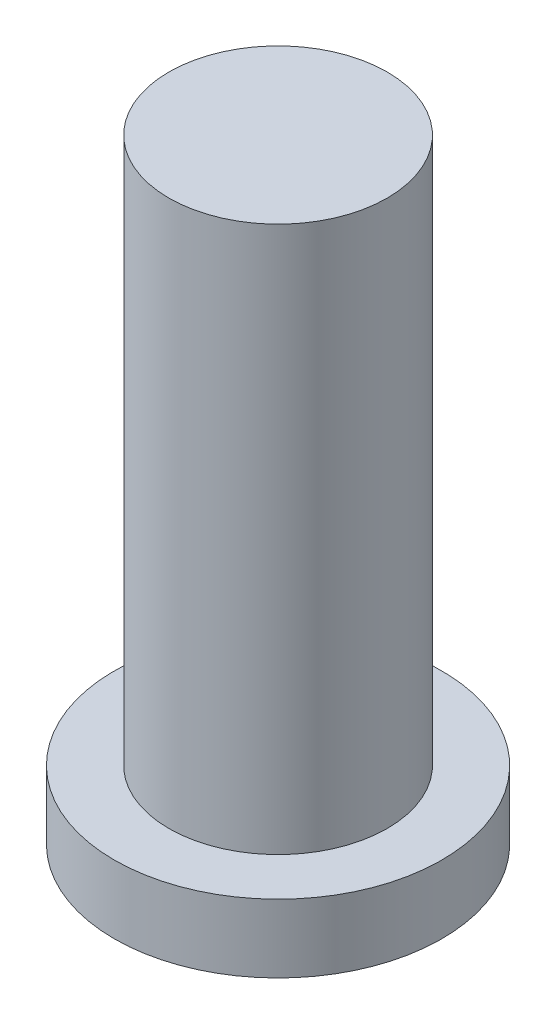
ISO-10303-21;
HEADER;
FILE_DESCRIPTION(('STEP AP214'),'2;1');
FILE_NAME('part.step','',(''),(''),'','','');
FILE_SCHEMA(('AUTOMOTIVE_DESIGN { 1 0 10303 214 1 1 1 1 }'));
ENDSEC;
DATA;
#1=APPLICATION_CONTEXT('core data for automotive mechanical design processes');
#2=APPLICATION_PROTOCOL_DEFINITION('international standard','automotive_design',2000,#1);
#3=PRODUCT_CONTEXT('',#1,'mechanical');
#4=PRODUCT('Part','Part','',(#3));
#5=PRODUCT_RELATED_PRODUCT_CATEGORY('part','',(#4));
#6=PRODUCT_DEFINITION_FORMATION('','',#4);
#7=PRODUCT_DEFINITION_CONTEXT('part definition',#1,'design');
#8=PRODUCT_DEFINITION('design','',#6,#7);
#9=PRODUCT_DEFINITION_SHAPE('','',#8);
#10=(LENGTH_UNIT() NAMED_UNIT(*) SI_UNIT(.MILLI.,.METRE.));
#11=(NAMED_UNIT(*) PLANE_ANGLE_UNIT() SI_UNIT($,.RADIAN.));
#12=(NAMED_UNIT(*) SI_UNIT($,.STERADIAN.) SOLID_ANGLE_UNIT());
#13=UNCERTAINTY_MEASURE_WITH_UNIT(LENGTH_MEASURE(1.E-05),#10,'distance_accuracy_value','');
#14=(GEOMETRIC_REPRESENTATION_CONTEXT(3) GLOBAL_UNCERTAINTY_ASSIGNED_CONTEXT((#13)) GLOBAL_UNIT_ASSIGNED_CONTEXT((#10,
#11,#12)) REPRESENTATION_CONTEXT('',''));
#15=CARTESIAN_POINT('',(0.,0.,0.));
#16=DIRECTION('',(0.,0.,1.));
#17=DIRECTION('',(1.,0.,0.));
#18=AXIS2_PLACEMENT_3D('',#15,#16,#17);
#19=CARTESIAN_POINT('',(0.,0.,0.));
#20=DIRECTION('',(0.,1.,0.));
#21=DIRECTION('',(0.,0.,1.));
#22=AXIS2_PLACEMENT_3D('',#19,#20,#21);
#23=PLANE('',#22);
#24=CARTESIAN_POINT('',(0.,0.,0.));
#25=DIRECTION('',(0.,1.,0.));
#26=DIRECTION('',(0.,0.,1.));
#27=AXIS2_PLACEMENT_3D('',#24,#25,#26);
#28=CIRCLE('',#27,2.4);
#29=CARTESIAN_POINT('',(0.,0.,2.4));
#30=VERTEX_POINT('',#29);
#31=EDGE_CURVE('E65',#30,#30,#28,.T.);
#32=ORIENTED_EDGE('',*,*,#31,.F.);
#33=EDGE_LOOP('',(#32));
#34=FACE_BOUND('',#33,.T.);
#35=ADVANCED_FACE('F61',(#34),#23,.F.);
#36=CARTESIAN_POINT('',(0.,1.,0.));
#37=DIRECTION('',(0.,-1.,0.));
#38=DIRECTION('',(0.,0.,-1.));
#39=AXIS2_PLACEMENT_3D('',#36,#37,#38);
#40=CYLINDRICAL_SURFACE('',#39,2.4);
#41=CARTESIAN_POINT('',(0.,1.,0.));
#42=DIRECTION('',(0.,1.,0.));
#43=DIRECTION('',(0.,0.,1.));
#44=AXIS2_PLACEMENT_3D('',#41,#42,#43);
#45=CIRCLE('',#44,2.4);
#46=CARTESIAN_POINT('',(0.,1.,2.4));
#47=VERTEX_POINT('',#46);
#48=EDGE_CURVE('E70',#47,#47,#45,.T.);
#49=ORIENTED_EDGE('',*,*,#48,.F.);
#50=EDGE_LOOP('',(#49));
#51=FACE_BOUND('',#50,.T.);
#52=ORIENTED_EDGE('',*,*,#31,.T.);
#53=EDGE_LOOP('',(#52));
#54=FACE_BOUND('',#53,.T.);
#55=ADVANCED_FACE('F63',(#51,#54),#40,.T.);
#56=CARTESIAN_POINT('',(0.,1.,0.));
#57=DIRECTION('',(0.,1.,0.));
#58=DIRECTION('',(0.,0.,1.));
#59=AXIS2_PLACEMENT_3D('',#56,#57,#58);
#60=PLANE('',#59);
#61=CARTESIAN_POINT('',(0.,1.,0.));
#62=DIRECTION('',(0.,1.,0.));
#63=DIRECTION('',(0.,0.,1.));
#64=AXIS2_PLACEMENT_3D('',#61,#62,#63);
#65=CIRCLE('',#64,1.6);
#66=CARTESIAN_POINT('',(0.,1.,1.6));
#67=VERTEX_POINT('',#66);
#68=EDGE_CURVE('E11',#67,#67,#65,.T.);
#69=ORIENTED_EDGE('',*,*,#68,.F.);
#70=EDGE_LOOP('',(#69));
#71=FACE_BOUND('',#70,.T.);
#72=ORIENTED_EDGE('',*,*,#48,.T.);
#73=EDGE_LOOP('',(#72));
#74=FACE_BOUND('',#73,.T.);
#75=ADVANCED_FACE('F88',(#71,#74),#60,.T.);
#76=CARTESIAN_POINT('',(0.,9.,0.));
#77=DIRECTION('',(0.,-1.,0.));
#78=DIRECTION('',(0.,0.,-1.));
#79=AXIS2_PLACEMENT_3D('',#76,#77,#78);
#80=CYLINDRICAL_SURFACE('',#79,1.6);
#81=CARTESIAN_POINT('',(0.,9.,0.));
#82=DIRECTION('',(0.,1.,0.));
#83=DIRECTION('',(0.,0.,1.));
#84=AXIS2_PLACEMENT_3D('',#81,#82,#83);
#85=CIRCLE('',#84,1.6);
#86=CARTESIAN_POINT('',(0.,9.,1.6));
#87=VERTEX_POINT('',#86);
#88=EDGE_CURVE('E77',#87,#87,#85,.T.);
#89=ORIENTED_EDGE('',*,*,#88,.F.);
#90=EDGE_LOOP('',(#89));
#91=FACE_BOUND('',#90,.T.);
#92=ORIENTED_EDGE('',*,*,#68,.T.);
#93=EDGE_LOOP('',(#92));
#94=FACE_BOUND('',#93,.T.);
#95=ADVANCED_FACE('F95',(#91,#94),#80,.T.);
#96=CARTESIAN_POINT('',(0.,9.,0.));
#97=DIRECTION('',(0.,1.,0.));
#98=DIRECTION('',(0.,0.,1.));
#99=AXIS2_PLACEMENT_3D('',#96,#97,#98);
#100=PLANE('',#99);
#101=ORIENTED_EDGE('',*,*,#88,.T.);
#102=EDGE_LOOP('',(#101));
#103=FACE_BOUND('',#102,.T.);
#104=ADVANCED_FACE('F100',(#103),#100,.T.);
#105=CLOSED_SHELL('',(#35,#55,#75,#95,#104));
#106=MANIFOLD_SOLID_BREP('B2',#105);
#107=ADVANCED_BREP_SHAPE_REPRESENTATION('',(#18,#106),#14);
#108=SHAPE_DEFINITION_REPRESENTATION(#9,#107);
ENDSEC;
END-ISO-10303-21;
